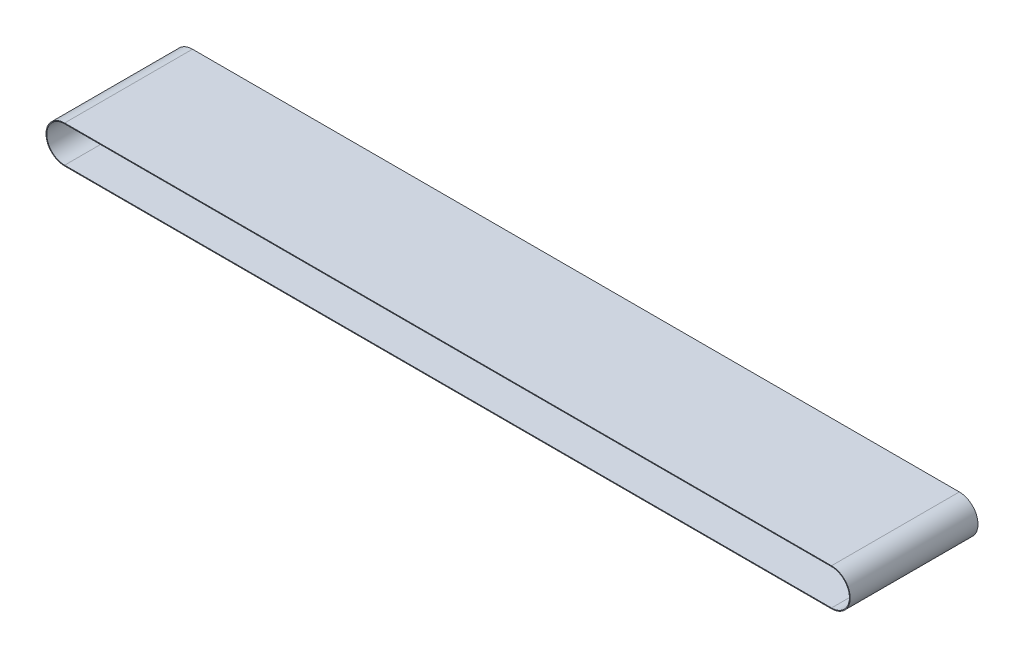
ISO-10303-21;
HEADER;
FILE_DESCRIPTION(('STEP AP214'),'2;1');
FILE_NAME('part.step','',(''),(''),'','','');
FILE_SCHEMA(('AUTOMOTIVE_DESIGN { 1 0 10303 214 1 1 1 1 }'));
ENDSEC;
DATA;
#1=APPLICATION_CONTEXT('core data for automotive mechanical design processes');
#2=APPLICATION_PROTOCOL_DEFINITION('international standard','automotive_design',2000,#1);
#3=PRODUCT_CONTEXT('',#1,'mechanical');
#4=PRODUCT('Part','Part','',(#3));
#5=PRODUCT_RELATED_PRODUCT_CATEGORY('part','',(#4));
#6=PRODUCT_DEFINITION_FORMATION('','',#4);
#7=PRODUCT_DEFINITION_CONTEXT('part definition',#1,'design');
#8=PRODUCT_DEFINITION('design','',#6,#7);
#9=PRODUCT_DEFINITION_SHAPE('','',#8);
#10=(LENGTH_UNIT() NAMED_UNIT(*) SI_UNIT(.MILLI.,.METRE.));
#11=(NAMED_UNIT(*) PLANE_ANGLE_UNIT() SI_UNIT($,.RADIAN.));
#12=(NAMED_UNIT(*) SI_UNIT($,.STERADIAN.) SOLID_ANGLE_UNIT());
#13=UNCERTAINTY_MEASURE_WITH_UNIT(LENGTH_MEASURE(1.E-05),#10,'distance_accuracy_value','');
#14=(GEOMETRIC_REPRESENTATION_CONTEXT(3) GLOBAL_UNCERTAINTY_ASSIGNED_CONTEXT((#13)) GLOBAL_UNIT_ASSIGNED_CONTEXT((#10,
#11,#12)) REPRESENTATION_CONTEXT('',''));
#15=CARTESIAN_POINT('',(0.,0.,0.));
#16=DIRECTION('',(0.,0.,1.));
#17=DIRECTION('',(1.,0.,0.));
#18=AXIS2_PLACEMENT_3D('',#15,#16,#17);
#19=CARTESIAN_POINT('',(-1500.,0.,500.));
#20=DIRECTION('',(0.,0.,1.));
#21=DIRECTION('',(1.,0.,0.));
#22=AXIS2_PLACEMENT_3D('',#19,#20,#21);
#23=PLANE('',#22);
#24=CARTESIAN_POINT('',(-1500.,0.,500.));
#25=DIRECTION('',(0.,0.,1.));
#26=DIRECTION('',(1.,0.,0.));
#27=AXIS2_PLACEMENT_3D('',#24,#25,#26);
#28=CIRCLE('',#27,72.9999999999996);
#29=CARTESIAN_POINT('',(-1500.,72.9999999999996,500.));
#30=VERTEX_POINT('',#29);
#31=CARTESIAN_POINT('',(-1500.,-72.9999999999996,500.));
#32=VERTEX_POINT('',#31);
#33=EDGE_CURVE('E135',#30,#32,#28,.T.);
#34=ORIENTED_EDGE('',*,*,#33,.T.);
#35=DIRECTION('',(1.,0.,0.));
#36=VECTOR('',#35,1.);
#37=CARTESIAN_POINT('',(-1500.,-72.9999999999996,500.));
#38=LINE('',#37,#36);
#39=CARTESIAN_POINT('',(1500.,-72.9999999999988,500.));
#40=VERTEX_POINT('',#39);
#41=EDGE_CURVE('E138',#32,#40,#38,.T.);
#42=ORIENTED_EDGE('',*,*,#41,.T.);
#43=CARTESIAN_POINT('',(1500.,5.51091059616309E-13,500.));
#44=DIRECTION('',(0.,0.,1.));
#45=DIRECTION('',(1.,0.,0.));
#46=AXIS2_PLACEMENT_3D('',#43,#44,#45);
#47=CIRCLE('',#46,72.9999999999993);
#48=CARTESIAN_POINT('',(1500.,72.9999999999996,500.));
#49=VERTEX_POINT('',#48);
#50=EDGE_CURVE('E141',#40,#49,#47,.T.);
#51=ORIENTED_EDGE('',*,*,#50,.T.);
#52=DIRECTION('',(-1.,0.,0.));
#53=VECTOR('',#52,1.);
#54=CARTESIAN_POINT('',(-1500.,72.9999999999996,500.));
#55=LINE('',#54,#53);
#56=EDGE_CURVE('E143',#49,#30,#55,.T.);
#57=ORIENTED_EDGE('',*,*,#56,.T.);
#58=EDGE_LOOP('',(#34,#42,#51,#57));
#59=FACE_BOUND('',#58,.T.);
#60=DIRECTION('',(1.,0.,0.));
#61=VECTOR('',#60,1.);
#62=CARTESIAN_POINT('',(-1500.,-70.,500.));
#63=LINE('',#62,#61);
#64=CARTESIAN_POINT('',(-1500.,-70.,500.));
#65=VERTEX_POINT('',#64);
#66=CARTESIAN_POINT('',(1500.,-69.9999999999994,500.));
#67=VERTEX_POINT('',#66);
#68=EDGE_CURVE('E107',#65,#67,#63,.T.);
#69=ORIENTED_EDGE('',*,*,#68,.F.);
#70=CARTESIAN_POINT('',(-1500.,0.,500.));
#71=DIRECTION('',(0.,0.,1.));
#72=DIRECTION('',(1.,0.,0.));
#73=AXIS2_PLACEMENT_3D('',#70,#71,#72);
#74=CIRCLE('',#73,70.);
#75=CARTESIAN_POINT('',(-1500.,70.,500.));
#76=VERTEX_POINT('',#75);
#77=EDGE_CURVE('E99',#76,#65,#74,.T.);
#78=ORIENTED_EDGE('',*,*,#77,.F.);
#79=DIRECTION('',(-1.,0.,0.));
#80=VECTOR('',#79,1.);
#81=CARTESIAN_POINT('',(-1500.,70.,500.));
#82=LINE('',#81,#80);
#83=CARTESIAN_POINT('',(1500.,70.0000000000006,500.));
#84=VERTEX_POINT('',#83);
#85=EDGE_CURVE('E121',#84,#76,#82,.T.);
#86=ORIENTED_EDGE('',*,*,#85,.F.);
#87=CARTESIAN_POINT('',(1500.,5.51091059616309E-13,500.));
#88=DIRECTION('',(0.,0.,1.));
#89=DIRECTION('',(1.,0.,0.));
#90=AXIS2_PLACEMENT_3D('',#87,#88,#89);
#91=CIRCLE('',#90,70.);
#92=EDGE_CURVE('E119',#67,#84,#91,.T.);
#93=ORIENTED_EDGE('',*,*,#92,.F.);
#94=EDGE_LOOP('',(#69,#78,#86,#93));
#95=FACE_BOUND('',#94,.T.);
#96=ADVANCED_FACE('F34',(#59,#95),#23,.T.);
#97=CARTESIAN_POINT('',(-1500.,0.,0.));
#98=DIRECTION('',(0.,0.,1.));
#99=DIRECTION('',(1.,0.,0.));
#100=AXIS2_PLACEMENT_3D('',#97,#98,#99);
#101=PLANE('',#100);
#102=CARTESIAN_POINT('',(-1500.,0.,0.));
#103=DIRECTION('',(0.,0.,1.));
#104=DIRECTION('',(1.,0.,0.));
#105=AXIS2_PLACEMENT_3D('',#102,#103,#104);
#106=CIRCLE('',#105,72.9999999999996);
#107=CARTESIAN_POINT('',(-1500.,72.9999999999996,0.));
#108=VERTEX_POINT('',#107);
#109=CARTESIAN_POINT('',(-1500.,-72.9999999999996,0.));
#110=VERTEX_POINT('',#109);
#111=EDGE_CURVE('E115',#108,#110,#106,.T.);
#112=ORIENTED_EDGE('',*,*,#111,.F.);
#113=DIRECTION('',(-1.,0.,0.));
#114=VECTOR('',#113,1.);
#115=CARTESIAN_POINT('',(-1500.,72.9999999999996,0.));
#116=LINE('',#115,#114);
#117=CARTESIAN_POINT('',(1500.,72.9999999999996,0.));
#118=VERTEX_POINT('',#117);
#119=EDGE_CURVE('E139',#118,#108,#116,.T.);
#120=ORIENTED_EDGE('',*,*,#119,.F.);
#121=CARTESIAN_POINT('',(1500.,5.51091059616309E-13,0.));
#122=DIRECTION('',(0.,0.,1.));
#123=DIRECTION('',(1.,0.,0.));
#124=AXIS2_PLACEMENT_3D('',#121,#122,#123);
#125=CIRCLE('',#124,72.9999999999993);
#126=CARTESIAN_POINT('',(1500.,-72.9999999999988,0.));
#127=VERTEX_POINT('',#126);
#128=EDGE_CURVE('E150',#127,#118,#125,.T.);
#129=ORIENTED_EDGE('',*,*,#128,.F.);
#130=DIRECTION('',(1.,0.,0.));
#131=VECTOR('',#130,1.);
#132=CARTESIAN_POINT('',(-1500.,-72.9999999999996,0.));
#133=LINE('',#132,#131);
#134=EDGE_CURVE('E148',#110,#127,#133,.T.);
#135=ORIENTED_EDGE('',*,*,#134,.F.);
#136=EDGE_LOOP('',(#112,#120,#129,#135));
#137=FACE_BOUND('',#136,.T.);
#138=CARTESIAN_POINT('',(-1500.,0.,0.));
#139=DIRECTION('',(0.,0.,1.));
#140=DIRECTION('',(1.,0.,0.));
#141=AXIS2_PLACEMENT_3D('',#138,#139,#140);
#142=CIRCLE('',#141,70.);
#143=CARTESIAN_POINT('',(-1500.,70.,0.));
#144=VERTEX_POINT('',#143);
#145=CARTESIAN_POINT('',(-1500.,-70.,0.));
#146=VERTEX_POINT('',#145);
#147=EDGE_CURVE('E57',#144,#146,#142,.T.);
#148=ORIENTED_EDGE('',*,*,#147,.T.);
#149=DIRECTION('',(1.,0.,0.));
#150=VECTOR('',#149,1.);
#151=CARTESIAN_POINT('',(-1500.,-70.,0.));
#152=LINE('',#151,#150);
#153=CARTESIAN_POINT('',(1500.,-69.9999999999994,0.));
#154=VERTEX_POINT('',#153);
#155=EDGE_CURVE('E114',#146,#154,#152,.T.);
#156=ORIENTED_EDGE('',*,*,#155,.T.);
#157=CARTESIAN_POINT('',(1500.,5.51091059616309E-13,0.));
#158=DIRECTION('',(0.,0.,1.));
#159=DIRECTION('',(1.,0.,0.));
#160=AXIS2_PLACEMENT_3D('',#157,#158,#159);
#161=CIRCLE('',#160,70.);
#162=CARTESIAN_POINT('',(1500.,70.0000000000006,0.));
#163=VERTEX_POINT('',#162);
#164=EDGE_CURVE('E127',#154,#163,#161,.T.);
#165=ORIENTED_EDGE('',*,*,#164,.T.);
#166=DIRECTION('',(-1.,0.,0.));
#167=VECTOR('',#166,1.);
#168=CARTESIAN_POINT('',(-1500.,70.,0.));
#169=LINE('',#168,#167);
#170=EDGE_CURVE('E108',#163,#144,#169,.T.);
#171=ORIENTED_EDGE('',*,*,#170,.T.);
#172=EDGE_LOOP('',(#148,#156,#165,#171));
#173=FACE_BOUND('',#172,.T.);
#174=ADVANCED_FACE('F168',(#137,#173),#101,.F.);
#175=CARTESIAN_POINT('',(-1500.,0.,500.));
#176=DIRECTION('',(0.,0.,-1.));
#177=DIRECTION('',(-1.,0.,0.));
#178=AXIS2_PLACEMENT_3D('',#175,#176,#177);
#179=CYLINDRICAL_SURFACE('',#178,72.9999999999996);
#180=ORIENTED_EDGE('',*,*,#111,.T.);
#181=DIRECTION('',(0.,0.,-1.));
#182=VECTOR('',#181,1.);
#183=CARTESIAN_POINT('',(-1500.,-72.9999999999996,500.));
#184=LINE('',#183,#182);
#185=EDGE_CURVE('E11',#32,#110,#184,.T.);
#186=ORIENTED_EDGE('',*,*,#185,.F.);
#187=ORIENTED_EDGE('',*,*,#33,.F.);
#188=DIRECTION('',(0.,0.,-1.));
#189=VECTOR('',#188,1.);
#190=CARTESIAN_POINT('',(-1500.,72.9999999999996,500.));
#191=LINE('',#190,#189);
#192=EDGE_CURVE('E145',#30,#108,#191,.T.);
#193=ORIENTED_EDGE('',*,*,#192,.T.);
#194=EDGE_LOOP('',(#180,#186,#187,#193));
#195=FACE_BOUND('',#194,.T.);
#196=ADVANCED_FACE('F36',(#195),#179,.T.);
#197=CARTESIAN_POINT('',(-1500.,-72.9999999999996,500.));
#198=DIRECTION('',(0.,1.,0.));
#199=DIRECTION('',(-1.,0.,0.));
#200=AXIS2_PLACEMENT_3D('',#197,#198,#199);
#201=PLANE('',#200);
#202=ORIENTED_EDGE('',*,*,#134,.T.);
#203=DIRECTION('',(0.,0.,-1.));
#204=VECTOR('',#203,1.);
#205=CARTESIAN_POINT('',(1500.,-72.9999999999988,500.));
#206=LINE('',#205,#204);
#207=EDGE_CURVE('E42',#40,#127,#206,.T.);
#208=ORIENTED_EDGE('',*,*,#207,.F.);
#209=ORIENTED_EDGE('',*,*,#41,.F.);
#210=ORIENTED_EDGE('',*,*,#185,.T.);
#211=EDGE_LOOP('',(#202,#208,#209,#210));
#212=FACE_BOUND('',#211,.T.);
#213=ADVANCED_FACE('F178',(#212),#201,.F.);
#214=CARTESIAN_POINT('',(1500.,5.51091059616309E-13,500.));
#215=DIRECTION('',(0.,0.,-1.));
#216=DIRECTION('',(-1.,0.,0.));
#217=AXIS2_PLACEMENT_3D('',#214,#215,#216);
#218=CYLINDRICAL_SURFACE('',#217,72.9999999999993);
#219=ORIENTED_EDGE('',*,*,#128,.T.);
#220=DIRECTION('',(0.,0.,-1.));
#221=VECTOR('',#220,1.);
#222=CARTESIAN_POINT('',(1500.,72.9999999999996,500.));
#223=LINE('',#222,#221);
#224=EDGE_CURVE('E155',#49,#118,#223,.T.);
#225=ORIENTED_EDGE('',*,*,#224,.F.);
#226=ORIENTED_EDGE('',*,*,#50,.F.);
#227=ORIENTED_EDGE('',*,*,#207,.T.);
#228=EDGE_LOOP('',(#219,#225,#226,#227));
#229=FACE_BOUND('',#228,.T.);
#230=ADVANCED_FACE('F162',(#229),#218,.T.);
#231=CARTESIAN_POINT('',(-1500.,72.9999999999996,500.));
#232=DIRECTION('',(0.,-1.,0.));
#233=DIRECTION('',(0.,0.,-1.));
#234=AXIS2_PLACEMENT_3D('',#231,#232,#233);
#235=PLANE('',#234);
#236=ORIENTED_EDGE('',*,*,#119,.T.);
#237=ORIENTED_EDGE('',*,*,#192,.F.);
#238=ORIENTED_EDGE('',*,*,#56,.F.);
#239=ORIENTED_EDGE('',*,*,#224,.T.);
#240=EDGE_LOOP('',(#236,#237,#238,#239));
#241=FACE_BOUND('',#240,.T.);
#242=ADVANCED_FACE('F172',(#241),#235,.F.);
#243=CARTESIAN_POINT('',(-1500.,0.,500.));
#244=DIRECTION('',(0.,0.,-1.));
#245=DIRECTION('',(-1.,0.,0.));
#246=AXIS2_PLACEMENT_3D('',#243,#244,#245);
#247=CYLINDRICAL_SURFACE('',#246,70.);
#248=ORIENTED_EDGE('',*,*,#147,.F.);
#249=DIRECTION('',(0.,0.,-1.));
#250=VECTOR('',#249,1.);
#251=CARTESIAN_POINT('',(-1500.,70.,500.));
#252=LINE('',#251,#250);
#253=EDGE_CURVE('E103',#76,#144,#252,.T.);
#254=ORIENTED_EDGE('',*,*,#253,.F.);
#255=ORIENTED_EDGE('',*,*,#77,.T.);
#256=DIRECTION('',(0.,0.,-1.));
#257=VECTOR('',#256,1.);
#258=CARTESIAN_POINT('',(-1500.,-70.,500.));
#259=LINE('',#258,#257);
#260=EDGE_CURVE('E102',#65,#146,#259,.T.);
#261=ORIENTED_EDGE('',*,*,#260,.T.);
#262=EDGE_LOOP('',(#248,#254,#255,#261));
#263=FACE_BOUND('',#262,.T.);
#264=ADVANCED_FACE('F101',(#263),#247,.F.);
#265=CARTESIAN_POINT('',(-1500.,-70.,500.));
#266=DIRECTION('',(0.,1.,0.));
#267=DIRECTION('',(-1.,0.,0.));
#268=AXIS2_PLACEMENT_3D('',#265,#266,#267);
#269=PLANE('',#268);
#270=ORIENTED_EDGE('',*,*,#155,.F.);
#271=ORIENTED_EDGE('',*,*,#260,.F.);
#272=ORIENTED_EDGE('',*,*,#68,.T.);
#273=DIRECTION('',(0.,0.,-1.));
#274=VECTOR('',#273,1.);
#275=CARTESIAN_POINT('',(1500.,-69.9999999999994,500.));
#276=LINE('',#275,#274);
#277=EDGE_CURVE('E116',#67,#154,#276,.T.);
#278=ORIENTED_EDGE('',*,*,#277,.T.);
#279=EDGE_LOOP('',(#270,#271,#272,#278));
#280=FACE_BOUND('',#279,.T.);
#281=ADVANCED_FACE('F111',(#280),#269,.T.);
#282=CARTESIAN_POINT('',(1500.,5.51091059616309E-13,500.));
#283=DIRECTION('',(0.,0.,-1.));
#284=DIRECTION('',(-1.,0.,0.));
#285=AXIS2_PLACEMENT_3D('',#282,#283,#284);
#286=CYLINDRICAL_SURFACE('',#285,70.);
#287=ORIENTED_EDGE('',*,*,#164,.F.);
#288=ORIENTED_EDGE('',*,*,#277,.F.);
#289=ORIENTED_EDGE('',*,*,#92,.T.);
#290=DIRECTION('',(0.,0.,-1.));
#291=VECTOR('',#290,1.);
#292=CARTESIAN_POINT('',(1500.,70.0000000000006,500.));
#293=LINE('',#292,#291);
#294=EDGE_CURVE('E49',#84,#163,#293,.T.);
#295=ORIENTED_EDGE('',*,*,#294,.T.);
#296=EDGE_LOOP('',(#287,#288,#289,#295));
#297=FACE_BOUND('',#296,.T.);
#298=ADVANCED_FACE('F201',(#297),#286,.F.);
#299=CARTESIAN_POINT('',(-1500.,70.,500.));
#300=DIRECTION('',(0.,-1.,0.));
#301=DIRECTION('',(1.,0.,0.));
#302=AXIS2_PLACEMENT_3D('',#299,#300,#301);
#303=PLANE('',#302);
#304=ORIENTED_EDGE('',*,*,#170,.F.);
#305=ORIENTED_EDGE('',*,*,#294,.F.);
#306=ORIENTED_EDGE('',*,*,#85,.T.);
#307=ORIENTED_EDGE('',*,*,#253,.T.);
#308=EDGE_LOOP('',(#304,#305,#306,#307));
#309=FACE_BOUND('',#308,.T.);
#310=ADVANCED_FACE('F205',(#309),#303,.T.);
#311=CLOSED_SHELL('',(#96,#174,#196,#213,#230,#242,#264,#281,#298,#310));
#312=MANIFOLD_SOLID_BREP('B2',#311);
#313=ADVANCED_BREP_SHAPE_REPRESENTATION('',(#18,#312),#14);
#314=SHAPE_DEFINITION_REPRESENTATION(#9,#313);
ENDSEC;
END-ISO-10303-21;
